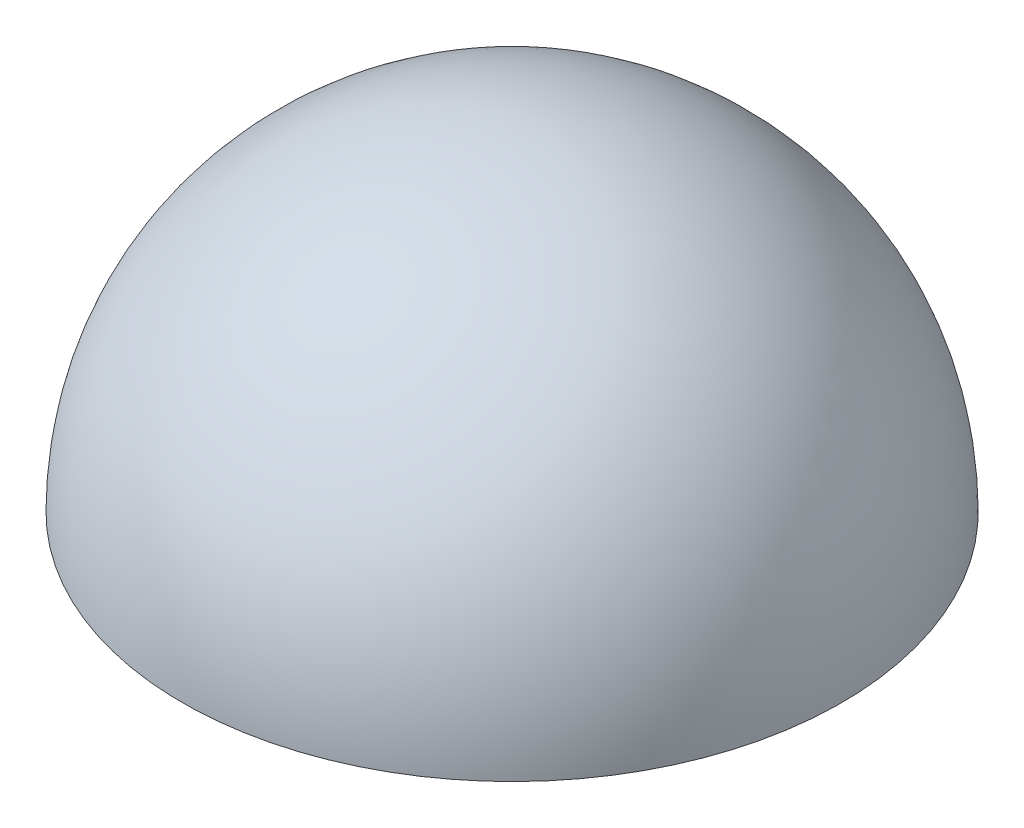
ISO-10303-21;
HEADER;
FILE_DESCRIPTION(('STEP AP214'),'2;1');
FILE_NAME('part.step','',(''),(''),'','','');
FILE_SCHEMA(('AUTOMOTIVE_DESIGN { 1 0 10303 214 1 1 1 1 }'));
ENDSEC;
DATA;
#1=APPLICATION_CONTEXT('core data for automotive mechanical design processes');
#2=APPLICATION_PROTOCOL_DEFINITION('international standard','automotive_design',2000,#1);
#3=PRODUCT_CONTEXT('',#1,'mechanical');
#4=PRODUCT('Part','Part','',(#3));
#5=PRODUCT_RELATED_PRODUCT_CATEGORY('part','',(#4));
#6=PRODUCT_DEFINITION_FORMATION('','',#4);
#7=PRODUCT_DEFINITION_CONTEXT('part definition',#1,'design');
#8=PRODUCT_DEFINITION('design','',#6,#7);
#9=PRODUCT_DEFINITION_SHAPE('','',#8);
#10=(LENGTH_UNIT() NAMED_UNIT(*) SI_UNIT(.MILLI.,.METRE.));
#11=(NAMED_UNIT(*) PLANE_ANGLE_UNIT() SI_UNIT($,.RADIAN.));
#12=(NAMED_UNIT(*) SI_UNIT($,.STERADIAN.) SOLID_ANGLE_UNIT());
#13=UNCERTAINTY_MEASURE_WITH_UNIT(LENGTH_MEASURE(1.E-05),#10,'distance_accuracy_value','');
#14=(GEOMETRIC_REPRESENTATION_CONTEXT(3) GLOBAL_UNCERTAINTY_ASSIGNED_CONTEXT((#13)) GLOBAL_UNIT_ASSIGNED_CONTEXT((#10,
#11,#12)) REPRESENTATION_CONTEXT('',''));
#15=CARTESIAN_POINT('',(0.,0.,0.));
#16=DIRECTION('',(0.,0.,1.));
#17=DIRECTION('',(1.,0.,0.));
#18=AXIS2_PLACEMENT_3D('',#15,#16,#17);
#19=CARTESIAN_POINT('',(0.,0.,47.));
#20=DIRECTION('',(0.,0.,-1.));
#21=DIRECTION('',(-1.,0.,0.));
#22=AXIS2_PLACEMENT_3D('',#19,#20,#21);
#23=SPHERICAL_SURFACE('',#22,47.);
#24=CARTESIAN_POINT('',(0.,0.,47.));
#25=DIRECTION('',(0.,-1.,0.));
#26=DIRECTION('',(0.,0.,-1.));
#27=AXIS2_PLACEMENT_3D('',#24,#25,#26);
#28=SPHERICAL_SURFACE('',#27,47.);
#29=CARTESIAN_POINT('',(0.,0.,47.));
#30=DIRECTION('',(0.,-1.,0.));
#31=DIRECTION('',(0.,0.,-1.));
#32=AXIS2_PLACEMENT_3D('',#29,#30,#31);
#33=CIRCLE('',#32,47.);
#34=CARTESIAN_POINT('',(0.,0.,0.));
#35=VERTEX_POINT('',#34);
#36=EDGE_CURVE('E10',#35,#35,#33,.T.);
#37=ORIENTED_EDGE('',*,*,#36,.F.);
#38=EDGE_LOOP('',(#37));
#39=FACE_BOUND('',#38,.T.);
#40=ADVANCED_FACE('F35',(#39),#28,.T.);
#41=CARTESIAN_POINT('',(0.,0.,47.));
#42=DIRECTION('',(0.,1.,0.));
#43=DIRECTION('',(0.,0.,-1.));
#44=AXIS2_PLACEMENT_3D('',#41,#42,#43);
#45=PLANE('',#44);
#46=CARTESIAN_POINT('',(0.,0.,47.));
#47=DIRECTION('',(0.,1.,0.));
#48=DIRECTION('',(-1.,0.,0.));
#49=AXIS2_PLACEMENT_3D('',#46,#47,#48);
#50=CIRCLE('',#49,46.);
#51=CARTESIAN_POINT('',(-45.9999999999999,-3.21216283173568E-13,47.));
#52=VERTEX_POINT('',#51);
#53=EDGE_CURVE('E41',#52,#52,#50,.F.);
#54=ORIENTED_EDGE('',*,*,#53,.F.);
#55=EDGE_LOOP('',(#54));
#56=FACE_BOUND('',#55,.T.);
#57=ORIENTED_EDGE('',*,*,#36,.T.);
#58=EDGE_LOOP('',(#57));
#59=FACE_BOUND('',#58,.T.);
#60=ADVANCED_FACE('F49',(#56,#59),#45,.F.);
#61=CARTESIAN_POINT('',(0.,0.,47.));
#62=DIRECTION('',(0.,0.,-1.));
#63=DIRECTION('',(-1.,0.,0.));
#64=AXIS2_PLACEMENT_3D('',#61,#62,#63);
#65=SPHERICAL_SURFACE('',#64,46.);
#66=CARTESIAN_POINT('',(0.,0.,47.));
#67=DIRECTION('',(0.,1.,0.));
#68=DIRECTION('',(-1.,0.,0.));
#69=AXIS2_PLACEMENT_3D('',#66,#67,#68);
#70=SPHERICAL_SURFACE('',#69,46.);
#71=ORIENTED_EDGE('',*,*,#53,.T.);
#72=EDGE_LOOP('',(#71));
#73=FACE_BOUND('',#72,.T.);
#74=ADVANCED_FACE('F47',(#73),#70,.F.);
#75=CLOSED_SHELL('',(#40,#60,#74));
#76=MANIFOLD_SOLID_BREP('B2',#75);
#77=ADVANCED_BREP_SHAPE_REPRESENTATION('',(#18,#76),#14);
#78=SHAPE_DEFINITION_REPRESENTATION(#9,#77);
ENDSEC;
END-ISO-10303-21;
